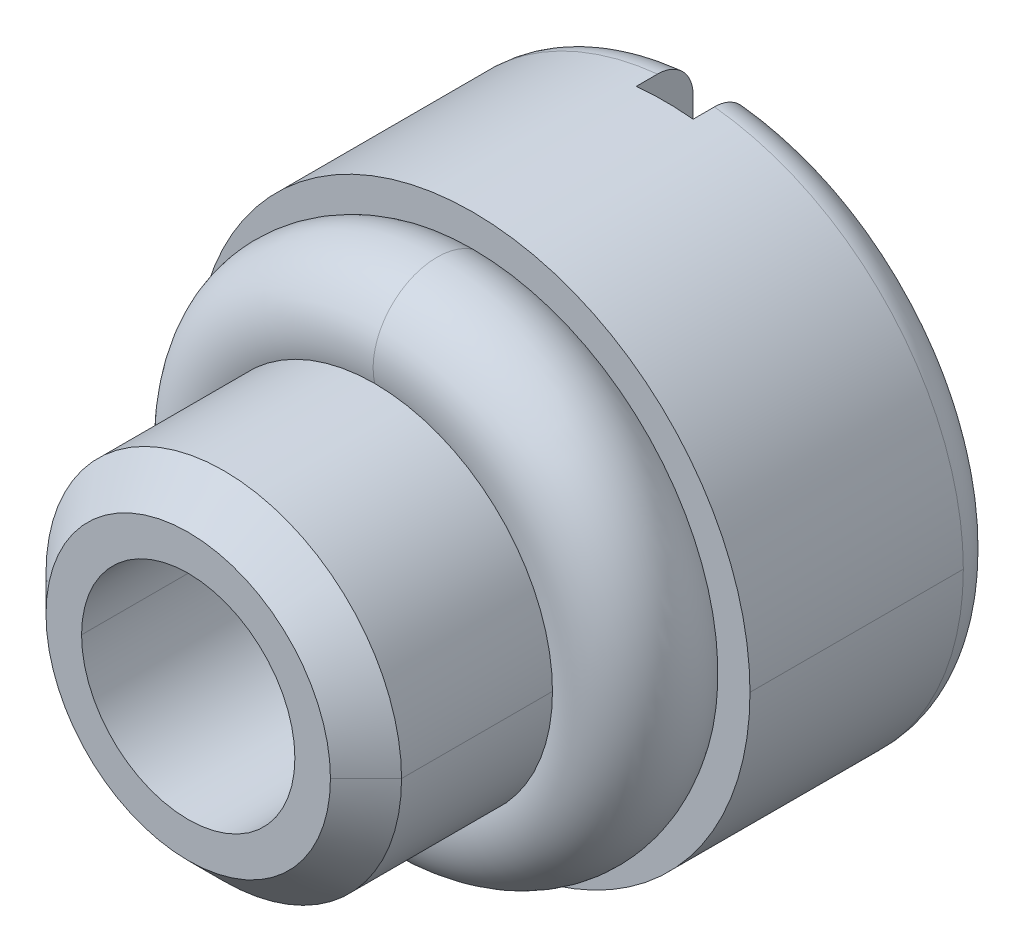
ISO-10303-21;
HEADER;
FILE_DESCRIPTION(('STEP AP214'),'2;1');
FILE_NAME('part.step','',(''),(''),'','','');
FILE_SCHEMA(('AUTOMOTIVE_DESIGN { 1 0 10303 214 1 1 1 1 }'));
ENDSEC;
DATA;
#1=APPLICATION_CONTEXT('core data for automotive mechanical design processes');
#2=APPLICATION_PROTOCOL_DEFINITION('international standard','automotive_design',2000,#1);
#3=PRODUCT_CONTEXT('',#1,'mechanical');
#4=PRODUCT('Part','Part','',(#3));
#5=PRODUCT_RELATED_PRODUCT_CATEGORY('part','',(#4));
#6=PRODUCT_DEFINITION_FORMATION('','',#4);
#7=PRODUCT_DEFINITION_CONTEXT('part definition',#1,'design');
#8=PRODUCT_DEFINITION('design','',#6,#7);
#9=PRODUCT_DEFINITION_SHAPE('','',#8);
#10=(LENGTH_UNIT() NAMED_UNIT(*) SI_UNIT(.MILLI.,.METRE.));
#11=(NAMED_UNIT(*) PLANE_ANGLE_UNIT() SI_UNIT($,.RADIAN.));
#12=(NAMED_UNIT(*) SI_UNIT($,.STERADIAN.) SOLID_ANGLE_UNIT());
#13=UNCERTAINTY_MEASURE_WITH_UNIT(LENGTH_MEASURE(1.E-05),#10,'distance_accuracy_value','');
#14=(GEOMETRIC_REPRESENTATION_CONTEXT(3) GLOBAL_UNCERTAINTY_ASSIGNED_CONTEXT((#13)) GLOBAL_UNIT_ASSIGNED_CONTEXT((#10,
#11,#12)) REPRESENTATION_CONTEXT('',''));
#15=CARTESIAN_POINT('',(0.,0.,0.));
#16=DIRECTION('',(0.,0.,1.));
#17=DIRECTION('',(1.,0.,0.));
#18=AXIS2_PLACEMENT_3D('',#15,#16,#17);
#19=CARTESIAN_POINT('',(0.4,5.115527708019,0.));
#20=DIRECTION('',(1.,0.,0.));
#21=DIRECTION('',(0.,1.,0.));
#22=AXIS2_PLACEMENT_3D('',#19,#20,#21);
#23=PLANE('',#22);
#24=CARTESIAN_POINT('',(0.400000000000024,-3.87943294825416,0.5));
#25=CARTESIAN_POINT('',(0.40000000411943,-3.87943311886585,0.491939682891677));
#26=CARTESIAN_POINT('',(0.400000345246995,-3.87923697986537,0.48387938101327));
#27=CARTESIAN_POINT('',(0.400001498944798,-3.8784525740742,0.467762278695054));
#28=CARTESIAN_POINT('',(0.400002312423804,-3.87786355108009,0.459705515048105));
#29=CARTESIAN_POINT('',(0.400004208510365,-3.87629234435605,0.443614536774049));
#30=CARTESIAN_POINT('',(0.400005291640127,-3.87530939546628,0.435580396855053));
#31=CARTESIAN_POINT('',(0.400007552872672,-3.87295048997405,0.419553825312462));
#32=CARTESIAN_POINT('',(0.400008731158619,-3.87157376180206,0.411561507252492));
#33=CARTESIAN_POINT('',(0.400011030540115,-3.86842832578584,0.395637822889961));
#34=CARTESIAN_POINT('',(0.400012151516973,-3.8666588419925,0.387706609858658));
#35=CARTESIAN_POINT('',(0.400014210065351,-3.86272989430234,0.371924411793107));
#36=CARTESIAN_POINT('',(0.400015147263054,-3.86056965238062,0.36407362044483));
#37=CARTESIAN_POINT('',(0.400016739511352,-3.85586214366341,0.348471528663627));
#38=CARTESIAN_POINT('',(0.400017393984578,-3.85331409911707,0.340720462894336));
#39=CARTESIAN_POINT('',(0.400018351940671,-3.84783490740447,0.32533702335693));
#40=CARTESIAN_POINT('',(0.400018654700897,-3.84490298520424,0.317704925635428));
#41=CARTESIAN_POINT('',(0.400018872847417,-3.83866092847447,0.302578512767008));
#42=CARTESIAN_POINT('',(0.400018787431109,-3.83535002413462,0.295084515289337));
#43=CARTESIAN_POINT('',(0.400018227679535,-3.82835586208734,0.280253233561971));
#44=CARTESIAN_POINT('',(0.400017752533676,-3.82467184235399,0.272916308670156));
#45=CARTESIAN_POINT('',(0.400016450814604,-3.81693827487332,0.258417893396746));
#46=CARTESIAN_POINT('',(0.400015623505207,-3.81288797548327,0.251256803948694));
#47=CARTESIAN_POINT('',(0.400013692239151,-3.80442963508127,0.237128520519677));
#48=CARTESIAN_POINT('',(0.400012587700975,-3.80002085542972,0.230161768748964));
#49=CARTESIAN_POINT('',(0.400010235432494,-3.79085429643702,0.216440314763256));
#50=CARTESIAN_POINT('',(0.400008987402353,-3.78609579408946,0.209686095557209));
#51=CARTESIAN_POINT('',(0.400006475847807,-3.77623946971036,0.196407490293331));
#52=CARTESIAN_POINT('',(0.400005212295948,-3.7711409429093,0.189883627348712));
#53=CARTESIAN_POINT('',(0.400003049243503,-3.76061520257124,0.177083148087374));
#54=CARTESIAN_POINT('',(0.400002150532419,-3.75518730513733,0.170807094215039));
#55=CARTESIAN_POINT('',(0.400000401083234,-3.74401429058611,0.158519037872238));
#56=CARTESIAN_POINT('',(0.399999550453086,-3.73826851281353,0.15250763581263));
#57=CARTESIAN_POINT('',(0.400000393997302,-3.72721322183282,0.141503146474786));
#58=CARTESIAN_POINT('',(0.400001786703737,-3.72193753278945,0.13647601644608));
#59=CARTESIAN_POINT('',(0.400007346035245,-3.71107907369244,0.12657170682327));
#60=CARTESIAN_POINT('',(0.400011560115864,-3.70549257542741,0.12169861211652));
#61=CARTESIAN_POINT('',(0.400021282927306,-3.6940126330278,0.112124067437141));
#62=CARTESIAN_POINT('',(0.400026812418038,-3.68811558849363,0.107426934590432));
#63=CARTESIAN_POINT('',(0.400038431950019,-3.67601592699402,0.0982265928395905));
#64=CARTESIAN_POINT('',(0.40004452980883,-3.66980985203254,0.0937279310381617));
#65=CARTESIAN_POINT('',(0.400056472856382,-3.6570949915595,0.0849474087376053));
#66=CARTESIAN_POINT('',(0.400062312249282,-3.65058290816412,0.0806703233748265));
#67=CARTESIAN_POINT('',(0.4000730916608,-3.63726042972391,0.0723563297749702));
#68=CARTESIAN_POINT('',(0.400078015616301,-3.63044691421796,0.0683244212367686));
#69=CARTESIAN_POINT('',(0.400086436606604,-3.61652760906326,0.0605245742999092));
#70=CARTESIAN_POINT('',(0.400089909695423,-3.60941889415471,0.0567618555821587));
#71=CARTESIAN_POINT('',(0.400095054753623,-3.59491694985007,0.0495244991313788));
#72=CARTESIAN_POINT('',(0.400096697667245,-3.58752100831554,0.0460552951811159));
#73=CARTESIAN_POINT('',(0.400097974287996,-3.57245417641281,0.0394292892686794));
#74=CARTESIAN_POINT('',(0.400097576629634,-3.56478080507595,0.0362781279908641));
#75=CARTESIAN_POINT('',(0.400094749693082,-3.54917056309561,0.0303126194517084));
#76=CARTESIAN_POINT('',(0.400092289666376,-3.5412314607236,0.0275041111912656));
#77=CARTESIAN_POINT('',(0.400085519638713,-3.5251031623471,0.0222482827369908));
#78=CARTESIAN_POINT('',(0.400081182531086,-3.51691200185649,0.0198069898571957));
#79=CARTESIAN_POINT('',(0.400071063770447,-3.50029501431835,0.015309785569112));
#80=CARTESIAN_POINT('',(0.400065261786776,-3.4918675078599,0.0132600782811833));
#81=CARTESIAN_POINT('',(0.400052860961045,-3.47479533369004,0.00956991538376813));
#82=CARTESIAN_POINT('',(0.400046251780464,-3.46614928919486,0.00793582781421679));
#83=CARTESIAN_POINT('',(0.400033150918901,-3.44865967098365,0.00510025705044405));
#84=CARTESIAN_POINT('',(0.400026662267545,-3.439815040284,0.00390529092116612));
#85=CARTESIAN_POINT('',(0.400014986283588,-3.4219500422299,0.00197075090288582));
#86=CARTESIAN_POINT('',(0.400009818567777,-3.4129289543087,0.00123782842798919));
#87=CARTESIAN_POINT('',(0.400002322995719,-3.39473503225962,0.000248942282012794));
#88=CARTESIAN_POINT('',(0.400000035561039,-3.38556183013564,-2.58544224473679E-07));
#89=CARTESIAN_POINT('',(0.400000000000008,-3.376388603227,0.));
#90=B_SPLINE_CURVE_WITH_KNOTS('',3,(#24,#25,#26,#27,#28,#29,#30,#31,#32,#33,#34,#35,#36,#37,#38,
#39,#40,#41,#42,#43,#44,#45,#46,#47,#48,#49,#50,#51,#52,#53,#54,#55,#56,#57,#58,#59,#60,#61,#62,
#63,#64,#65,#66,#67,#68,#69,#70,#71,#72,#73,#74,#75,#76,#77,#78,#79,#80,#81,#82,#83,#84,#85,#86,
#87,#88,#89),.UNSPECIFIED.,.F.,.F.,(4,2,2,2,2,2,2,2,2,2,2,2,2,2,2,2,2,2,2,2,2,2,2,2,2,2,2,2,2,2,
2,2,4),(0.,0.0241785456849397,0.0484037638321221,0.0726762667819843,0.0969966588605872,
0.121365534196,0.145783474592244,0.170251047479141,0.194768803955896,0.219337276945519,
0.243956979476288,0.268628403105435,0.293352016498981,0.318128264180356,0.342957565458916,
0.367840313547933,0.392776874879966,0.414632076905412,0.436864440437732,0.459474150276638,
0.482461351356608,0.505826150199764,0.529568616464974,0.553688784611573,0.578186655693591,
0.603062199297886,0.628315355636827,0.653946037803447,0.679954134194065,0.706339511100476,
0.733102015470839,0.760241477835435,0.78775771539061),.UNSPECIFIED.);
#91=CARTESIAN_POINT('',(0.4,-3.879432948254,0.5));
#92=VERTEX_POINT('',#91);
#93=CARTESIAN_POINT('',(0.4,-3.376388603227,0.));
#94=VERTEX_POINT('',#93);
#95=EDGE_CURVE('E285',#92,#94,#90,.T.);
#96=ORIENTED_EDGE('',*,*,#95,.F.);
#97=DIRECTION('',(0.,0.,1.));
#98=VECTOR('',#97,1.);
#99=CARTESIAN_POINT('',(0.4,-3.879432948254,0.5));
#100=LINE('',#99,#98);
#101=CARTESIAN_POINT('',(0.4,-3.879432948254,0.8));
#102=VERTEX_POINT('',#101);
#103=EDGE_CURVE('E270',#92,#102,#100,.T.);
#104=ORIENTED_EDGE('',*,*,#103,.T.);
#105=DIRECTION('',(0.,-1.,0.));
#106=VECTOR('',#105,1.);
#107=CARTESIAN_POINT('',(0.4,3.879432948254,0.8));
#108=LINE('',#107,#106);
#109=CARTESIAN_POINT('',(0.4,3.879432948254,0.8));
#110=VERTEX_POINT('',#109);
#111=EDGE_CURVE('E372',#110,#102,#108,.T.);
#112=ORIENTED_EDGE('',*,*,#111,.F.);
#113=DIRECTION('',(0.,0.,1.));
#114=VECTOR('',#113,1.);
#115=CARTESIAN_POINT('',(0.4,3.879432948254,0.5));
#116=LINE('',#115,#114);
#117=CARTESIAN_POINT('',(0.4,3.879432948254,0.5));
#118=VERTEX_POINT('',#117);
#119=EDGE_CURVE('E236',#118,#110,#116,.T.);
#120=ORIENTED_EDGE('',*,*,#119,.F.);
#121=CARTESIAN_POINT('',(0.400000000000015,3.376388603227,0.));
#122=CARTESIAN_POINT('',(0.400000035496117,3.38556007250395,-2.58357679064873E-07));
#123=CARTESIAN_POINT('',(0.400002326566478,3.39473151704892,0.000248846894338523));
#124=CARTESIAN_POINT('',(0.400009836643193,3.41292217304346,0.00123736578149127));
#125=CARTESIAN_POINT('',(0.400015015196688,3.42194175166684,0.00197003037706167));
#126=CARTESIAN_POINT('',(0.400026719728556,3.43980399052667,0.00390392100200372));
#127=CARTESIAN_POINT('',(0.400033226027681,3.44864736974604,0.00509850902852898));
#128=CARTESIAN_POINT('',(0.400046368087285,3.46613475001073,0.00793323202857667));
#129=CARTESIAN_POINT('',(0.400053000739028,3.47477980575559,0.00956686290376455));
#130=CARTESIAN_POINT('',(0.400065453015203,3.49185026867413,0.0132560617806501));
#131=CARTESIAN_POINT('',(0.400071282893362,3.50027704970852,0.0153052742359382));
#132=CARTESIAN_POINT('',(0.400081460160859,3.51689284981066,0.0198014777381134));
#133=CARTESIAN_POINT('',(0.400085827801849,3.52508354478869,0.0222422766584838));
#134=CARTESIAN_POINT('',(0.400092659493926,3.54121116897085,0.0274971438420761));
#135=CARTESIAN_POINT('',(0.400095150589358,3.54915005864375,0.0303051962657034));
#136=CARTESIAN_POINT('',(0.400098037862905,3.5647601220695,0.0362698555519004));
#137=CARTESIAN_POINT('',(0.400098464754512,3.57243352307685,0.0394206343540578));
#138=CARTESIAN_POINT('',(0.400097242177479,3.58750064811668,0.0460459712961635));
#139=CARTESIAN_POINT('',(0.400095624076849,3.59489684824577,0.0495148991489322));
#140=CARTESIAN_POINT('',(0.400090521416154,3.60939952777625,0.0567518305620664));
#141=CARTESIAN_POINT('',(0.400087065961958,3.61650871410306,0.0605144101889511));
#142=CARTESIAN_POINT('',(0.400078670092498,3.63042916200437,0.0683141347632436));
#143=CARTESIAN_POINT('',(0.400073753730266,3.63724334333983,0.0723460693309703));
#144=CARTESIAN_POINT('',(0.400062976271893,3.65056733320358,0.080660296860517));
#145=CARTESIAN_POINT('',(0.400057131413543,3.65708025646114,0.0849375988805429));
#146=CARTESIAN_POINT('',(0.40004516131932,3.66979695456756,0.0937187597602689));
#147=CARTESIAN_POINT('',(0.400039042126245,3.67600402138626,0.0982178517040434));
#148=CARTESIAN_POINT('',(0.400027359959277,3.68810580135465,0.107419279678737));
#149=CARTESIAN_POINT('',(0.40002178951313,3.69400396645077,0.112117076301914));
#150=CARTESIAN_POINT('',(0.400011964405197,3.70548626026554,0.121693192572679));
#151=CARTESIAN_POINT('',(0.40000768937348,3.71107398324901,0.126567202276457));
#152=CARTESIAN_POINT('',(0.400001974925644,3.72193497774857,0.136473600980589));
#153=CARTESIAN_POINT('',(0.400000488729355,3.72721197127902,0.141501911783646));
#154=CARTESIAN_POINT('',(0.399999442597034,3.73826748589524,0.152506602075751));
#155=CARTESIAN_POINT('',(0.400000182672797,3.74401228805153,0.158516918290141));
#156=CARTESIAN_POINT('',(0.400001745376393,3.75518359060634,0.170802853411092));
#157=CARTESIAN_POINT('',(0.400002567824597,3.76061074441032,0.177077878482907));
#158=CARTESIAN_POINT('',(0.400004599515063,3.77113522104825,0.189876376509366));
#159=CARTESIAN_POINT('',(0.400005807931719,3.77623322022944,0.196399293209411));
#160=CARTESIAN_POINT('',(0.400008231063028,3.78608869467307,0.209676107392125));
#161=CARTESIAN_POINT('',(0.400009445758972,3.79084686687667,0.216429487546818));
#162=CARTESIAN_POINT('',(0.400011749997617,3.80001295066409,0.230149387438989));
#163=CARTESIAN_POINT('',(0.400012839797913,3.80442157717033,0.237115429538673));
#164=CARTESIAN_POINT('',(0.400014757888307,3.81287977426078,0.251242438035212));
#165=CARTESIAN_POINT('',(0.400015586719562,3.81693007516795,0.258402967168694));
#166=CARTESIAN_POINT('',(0.400016905067334,3.8246637849133,0.272900424197517));
#167=CARTESIAN_POINT('',(0.400017395283645,3.82834793686828,0.28023695567355));
#168=CARTESIAN_POINT('',(0.400017996023911,3.83534247740018,0.295067628423346));
#169=CARTESIAN_POINT('',(0.400018107326896,3.83865361929133,0.302561414413611));
#170=CARTESIAN_POINT('',(0.400017948969169,3.84489623875603,0.31768759502796));
#171=CARTESIAN_POINT('',(0.400017680085369,3.84782847726608,0.325319675611443));
#172=CARTESIAN_POINT('',(0.400016795010385,3.85330836182355,0.340703281786584));
#173=CARTESIAN_POINT('',(0.400016179522895,3.85585677389271,0.348454534509922));
#174=CARTESIAN_POINT('',(0.400014667441752,3.86056504970091,0.364057208576017));
#175=CARTESIAN_POINT('',(0.400013771414063,3.86272568206384,0.371908397979727));
#176=CARTESIAN_POINT('',(0.400011794440394,3.86665541395708,0.387691605227491));
#177=CARTESIAN_POINT('',(0.400010713865071,3.8684252822942,0.395623431654344));
#178=CARTESIAN_POINT('',(0.400008491546515,3.87157146167327,0.411548557783676));
#179=CARTESIAN_POINT('',(0.400007349927676,3.87294853937851,0.419541706026963));
#180=CARTESIAN_POINT('',(0.400005155314518,3.87530808908664,0.435570152021603));
#181=CARTESIAN_POINT('',(0.400004102152155,3.87629132332917,0.443605337564973));
#182=CARTESIAN_POINT('',(0.400002256327129,3.87786301687455,0.459698617499326));
#183=CARTESIAN_POINT('',(0.400001463167228,3.87845223198474,0.467756638082986));
#184=CARTESIAN_POINT('',(0.400000337498178,3.87923690961059,0.483876458259292));
#185=CARTESIAN_POINT('',(0.400000004115657,3.87943311898315,0.491938221507288));
#186=CARTESIAN_POINT('',(0.400000000000011,3.87943294825416,0.5));
#187=B_SPLINE_CURVE_WITH_KNOTS('',3,(#121,#122,#123,#124,#125,#126,#127,#128,#129,#130,#131,
#132,#133,#134,#135,#136,#137,#138,#139,#140,#141,#142,#143,#144,#145,#146,#147,#148,#149,#150,
#151,#152,#153,#154,#155,#156,#157,#158,#159,#160,#161,#162,#163,#164,#165,#166,#167,#168,#169,
#170,#171,#172,#173,#174,#175,#176,#177,#178,#179,#180,#181,#182,#183,#184,#185,#186),
.UNSPECIFIED.,.F.,.F.,(4,2,2,2,2,2,2,2,2,2,2,2,2,2,2,2,2,2,2,2,2,2,2,2,2,2,2,2,2,2,2,2,4),(0.,
0.0275109667349627,0.0546458599966674,0.0814044973013111,0.107786709475477,0.133792343734969,
0.159421266605746,0.184673366680241,0.209548557205221,0.23404677850023,0.258168000208683,
0.28191222338651,0.305279482436198,0.328269846896788,0.350883423103084,0.373120355729888,
0.394980829239495,0.419913019581982,0.444791978230703,0.469618072059476,0.494391694691602,
0.51911326581399,0.543783230293978,0.568402057106752,0.592970238082889,0.617488286487157,
0.641956735441176,0.66637613620386,0.690747056324809,0.715070077686847,0.739345794454821,
0.763574810948463,0.787757739457687),.UNSPECIFIED.);
#188=CARTESIAN_POINT('',(0.4,3.376388603227,0.));
#189=VERTEX_POINT('',#188);
#190=EDGE_CURVE('E233',#189,#118,#187,.T.);
#191=ORIENTED_EDGE('',*,*,#190,.F.);
#192=DIRECTION('',(0.,1.,0.));
#193=VECTOR('',#192,1.);
#194=CARTESIAN_POINT('',(0.4,-3.376388603227,0.));
#195=LINE('',#194,#193);
#196=EDGE_CURVE('E288',#94,#189,#195,.T.);
#197=ORIENTED_EDGE('',*,*,#196,.F.);
#198=EDGE_LOOP('',(#96,#104,#112,#120,#191,#197));
#199=FACE_BOUND('',#198,.T.);
#200=ADVANCED_FACE('F16',(#199),#23,.F.);
#201=CARTESIAN_POINT('',(0.,0.,3.5));
#202=DIRECTION('',(0.,0.,1.));
#203=DIRECTION('',(1.,0.,0.));
#204=AXIS2_PLACEMENT_3D('',#201,#202,#203);
#205=PLANE('',#204);
#206=CARTESIAN_POINT('',(0.,0.,3.5));
#207=DIRECTION('',(0.,0.,1.));
#208=DIRECTION('',(-1.,0.,0.));
#209=AXIS2_PLACEMENT_3D('',#206,#207,#208);
#210=CIRCLE('',#209,1.5);
#211=CARTESIAN_POINT('',(-1.5,0.,3.5));
#212=VERTEX_POINT('',#211);
#213=CARTESIAN_POINT('',(1.5,0.,3.5));
#214=VERTEX_POINT('',#213);
#215=EDGE_CURVE('E11',#212,#214,#210,.T.);
#216=ORIENTED_EDGE('',*,*,#215,.T.);
#217=CARTESIAN_POINT('',(0.,0.,3.5));
#218=DIRECTION('',(0.,0.,1.));
#219=DIRECTION('',(1.,0.,0.));
#220=AXIS2_PLACEMENT_3D('',#217,#218,#219);
#221=CIRCLE('',#220,1.5);
#222=EDGE_CURVE('E355',#214,#212,#221,.T.);
#223=ORIENTED_EDGE('',*,*,#222,.T.);
#224=EDGE_LOOP('',(#216,#223));
#225=FACE_BOUND('',#224,.T.);
#226=ADVANCED_FACE('F256',(#225),#205,.T.);
#227=CARTESIAN_POINT('',(0.,0.,7.5));
#228=DIRECTION('',(0.,0.,1.));
#229=DIRECTION('',(1.,0.,0.));
#230=AXIS2_PLACEMENT_3D('',#227,#228,#229);
#231=CYLINDRICAL_SURFACE('',#230,1.5);
#232=DIRECTION('',(0.,0.,-1.));
#233=VECTOR('',#232,1.);
#234=CARTESIAN_POINT('',(1.5,0.,7.5));
#235=LINE('',#234,#233);
#236=CARTESIAN_POINT('',(1.5,0.,7.5));
#237=VERTEX_POINT('',#236);
#238=EDGE_CURVE('E27',#237,#214,#235,.T.);
#239=ORIENTED_EDGE('',*,*,#238,.T.);
#240=ORIENTED_EDGE('',*,*,#215,.F.);
#241=DIRECTION('',(0.,0.,-1.));
#242=VECTOR('',#241,1.);
#243=CARTESIAN_POINT('',(-1.5,0.,7.5));
#244=LINE('',#243,#242);
#245=CARTESIAN_POINT('',(-1.5,0.,7.5));
#246=VERTEX_POINT('',#245);
#247=EDGE_CURVE('E358',#246,#212,#244,.T.);
#248=ORIENTED_EDGE('',*,*,#247,.F.);
#249=CARTESIAN_POINT('',(0.,0.,7.5));
#250=DIRECTION('',(0.,0.,1.));
#251=DIRECTION('',(-1.,0.,0.));
#252=AXIS2_PLACEMENT_3D('',#249,#250,#251);
#253=CIRCLE('',#252,1.5);
#254=EDGE_CURVE('E366',#246,#237,#253,.T.);
#255=ORIENTED_EDGE('',*,*,#254,.T.);
#256=EDGE_LOOP('',(#239,#240,#248,#255));
#257=FACE_BOUND('',#256,.T.);
#258=ADVANCED_FACE('F774',(#257),#231,.F.);
#259=CARTESIAN_POINT('',(0.,0.,7.5));
#260=DIRECTION('',(0.,0.,1.));
#261=DIRECTION('',(1.,0.,0.));
#262=AXIS2_PLACEMENT_3D('',#259,#260,#261);
#263=CYLINDRICAL_SURFACE('',#262,1.5);
#264=ORIENTED_EDGE('',*,*,#247,.T.);
#265=ORIENTED_EDGE('',*,*,#222,.F.);
#266=ORIENTED_EDGE('',*,*,#238,.F.);
#267=CARTESIAN_POINT('',(0.,0.,7.5));
#268=DIRECTION('',(0.,0.,1.));
#269=DIRECTION('',(1.,0.,0.));
#270=AXIS2_PLACEMENT_3D('',#267,#268,#269);
#271=CIRCLE('',#270,1.5);
#272=EDGE_CURVE('E400',#237,#246,#271,.T.);
#273=ORIENTED_EDGE('',*,*,#272,.T.);
#274=EDGE_LOOP('',(#264,#265,#266,#273));
#275=FACE_BOUND('',#274,.T.);
#276=ADVANCED_FACE('F828',(#275),#263,.F.);
#277=CARTESIAN_POINT('',(0.,0.,3.5));
#278=DIRECTION('',(0.,0.,1.));
#279=DIRECTION('',(1.,0.,0.));
#280=AXIS2_PLACEMENT_3D('',#277,#278,#279);
#281=CYLINDRICAL_SURFACE('',#280,2.5);
#282=DIRECTION('',(-4.561400527472E-12,8.076966315919E-11,1.));
#283=VECTOR('',#282,1.);
#284=CARTESIAN_POINT('',(2.5,0.,4.877496438739));
#285=LINE('',#284,#283);
#286=CARTESIAN_POINT('',(2.5,0.,4.877496438739));
#287=VERTEX_POINT('',#286);
#288=CARTESIAN_POINT('',(2.5,0.,7.));
#289=VERTEX_POINT('',#288);
#290=EDGE_CURVE('E344',#287,#289,#285,.T.);
#291=ORIENTED_EDGE('',*,*,#290,.F.);
#292=CARTESIAN_POINT('',(0.,0.,4.877496438739));
#293=DIRECTION('',(0.,0.,1.));
#294=DIRECTION('',(1.,0.,0.));
#295=AXIS2_PLACEMENT_3D('',#292,#293,#294);
#296=CIRCLE('',#295,2.5);
#297=CARTESIAN_POINT('',(0.,2.5,4.877496438739));
#298=VERTEX_POINT('',#297);
#299=EDGE_CURVE('E349',#287,#298,#296,.T.);
#300=ORIENTED_EDGE('',*,*,#299,.T.);
#301=CARTESIAN_POINT('',(0.,0.,4.877496438739));
#302=DIRECTION('',(0.,0.,1.));
#303=DIRECTION('',(0.,1.,0.));
#304=AXIS2_PLACEMENT_3D('',#301,#302,#303);
#305=CIRCLE('',#304,2.5);
#306=CARTESIAN_POINT('',(-2.5,0.,4.877496438739));
#307=VERTEX_POINT('',#306);
#308=EDGE_CURVE('E334',#298,#307,#305,.T.);
#309=ORIENTED_EDGE('',*,*,#308,.T.);
#310=DIRECTION('',(4.561400527472E-12,-8.076973695818E-11,1.));
#311=VECTOR('',#310,1.);
#312=CARTESIAN_POINT('',(-2.5,0.,4.877496438739));
#313=LINE('',#312,#311);
#314=CARTESIAN_POINT('',(-2.5,0.,7.));
#315=VERTEX_POINT('',#314);
#316=EDGE_CURVE('E340',#307,#315,#313,.T.);
#317=ORIENTED_EDGE('',*,*,#316,.T.);
#318=CARTESIAN_POINT('',(0.,0.,7.));
#319=DIRECTION('',(0.,0.,1.));
#320=DIRECTION('',(1.,0.,0.));
#321=AXIS2_PLACEMENT_3D('',#318,#319,#320);
#322=CIRCLE('',#321,2.5);
#323=EDGE_CURVE('E362',#289,#315,#322,.T.);
#324=ORIENTED_EDGE('',*,*,#323,.F.);
#325=EDGE_LOOP('',(#291,#300,#309,#317,#324));
#326=FACE_BOUND('',#325,.T.);
#327=ADVANCED_FACE('F18',(#326),#281,.T.);
#328=CARTESIAN_POINT('',(0.,0.,7.25000000001));
#329=DIRECTION('',(0.,0.,-1.));
#330=DIRECTION('',(0.,-1.,0.));
#331=AXIS2_PLACEMENT_3D('',#328,#329,#330);
#332=CONICAL_SURFACE('',#331,2.24999999999,0.7853981633973);
#333=DIRECTION('',(0.707106781186548,-1.61639900679411E-11,-0.707106781186548));
#334=VECTOR('',#333,1.);
#335=CARTESIAN_POINT('',(1.99999999999,1.828633453721E-10,7.50000000001));
#336=LINE('',#335,#334);
#337=CARTESIAN_POINT('',(2.,0.,7.5));
#338=VERTEX_POINT('',#337);
#339=EDGE_CURVE('E371',#338,#289,#336,.T.);
#340=ORIENTED_EDGE('',*,*,#339,.T.);
#341=ORIENTED_EDGE('',*,*,#323,.T.);
#342=DIRECTION('',(-0.707106781186548,1.61629412215311E-11,-0.707106781186548));
#343=VECTOR('',#342,1.);
#344=CARTESIAN_POINT('',(-1.99999999999,-1.828626887228E-10,7.50000000001));
#345=LINE('',#344,#343);
#346=CARTESIAN_POINT('',(-2.,0.,7.5));
#347=VERTEX_POINT('',#346);
#348=EDGE_CURVE('E407',#347,#315,#345,.T.);
#349=ORIENTED_EDGE('',*,*,#348,.F.);
#350=CARTESIAN_POINT('',(0.,0.,7.5));
#351=DIRECTION('',(0.,0.,1.));
#352=DIRECTION('',(1.,0.,0.));
#353=AXIS2_PLACEMENT_3D('',#350,#351,#352);
#354=CIRCLE('',#353,2.);
#355=EDGE_CURVE('E363',#338,#347,#354,.T.);
#356=ORIENTED_EDGE('',*,*,#355,.F.);
#357=EDGE_LOOP('',(#340,#341,#349,#356));
#358=FACE_BOUND('',#357,.T.);
#359=ADVANCED_FACE('F214',(#358),#332,.T.);
#360=CARTESIAN_POINT('',(0.,0.,7.5));
#361=DIRECTION('',(0.,0.,1.));
#362=DIRECTION('',(1.,0.,0.));
#363=AXIS2_PLACEMENT_3D('',#360,#361,#362);
#364=PLANE('',#363);
#365=ORIENTED_EDGE('',*,*,#254,.F.);
#366=ORIENTED_EDGE('',*,*,#272,.F.);
#367=EDGE_LOOP('',(#365,#366));
#368=FACE_BOUND('',#367,.T.);
#369=CARTESIAN_POINT('',(0.,0.,7.5));
#370=DIRECTION('',(0.,0.,1.));
#371=DIRECTION('',(-1.,0.,0.));
#372=AXIS2_PLACEMENT_3D('',#369,#370,#371);
#373=CIRCLE('',#372,2.);
#374=EDGE_CURVE('E367',#347,#338,#373,.T.);
#375=ORIENTED_EDGE('',*,*,#374,.T.);
#376=ORIENTED_EDGE('',*,*,#355,.T.);
#377=EDGE_LOOP('',(#375,#376));
#378=FACE_BOUND('',#377,.T.);
#379=ADVANCED_FACE('F495',(#368,#378),#364,.T.);
#380=CARTESIAN_POINT('',(0.,0.,7.25000000001));
#381=DIRECTION('',(0.,0.,-1.));
#382=DIRECTION('',(0.,-1.,0.));
#383=AXIS2_PLACEMENT_3D('',#380,#381,#382);
#384=CONICAL_SURFACE('',#383,2.24999999999,0.7853981633973);
#385=ORIENTED_EDGE('',*,*,#348,.T.);
#386=CARTESIAN_POINT('',(0.,0.,7.));
#387=DIRECTION('',(0.,0.,1.));
#388=DIRECTION('',(-1.,0.,0.));
#389=AXIS2_PLACEMENT_3D('',#386,#387,#388);
#390=CIRCLE('',#389,2.5);
#391=EDGE_CURVE('E379',#315,#289,#390,.T.);
#392=ORIENTED_EDGE('',*,*,#391,.T.);
#393=ORIENTED_EDGE('',*,*,#339,.F.);
#394=ORIENTED_EDGE('',*,*,#374,.F.);
#395=EDGE_LOOP('',(#385,#392,#393,#394));
#396=FACE_BOUND('',#395,.T.);
#397=ADVANCED_FACE('F260',(#396),#384,.T.);
#398=CARTESIAN_POINT('',(0.,0.,3.5));
#399=DIRECTION('',(0.,0.,1.));
#400=DIRECTION('',(1.,0.,0.));
#401=AXIS2_PLACEMENT_3D('',#398,#399,#400);
#402=CYLINDRICAL_SURFACE('',#401,2.5);
#403=ORIENTED_EDGE('',*,*,#316,.F.);
#404=CARTESIAN_POINT('',(0.,0.,4.877496438739));
#405=DIRECTION('',(0.,0.,1.));
#406=DIRECTION('',(-1.,0.,0.));
#407=AXIS2_PLACEMENT_3D('',#404,#405,#406);
#408=CIRCLE('',#407,2.5);
#409=CARTESIAN_POINT('',(0.,-2.5,4.877496438739));
#410=VERTEX_POINT('',#409);
#411=EDGE_CURVE('E331',#307,#410,#408,.T.);
#412=ORIENTED_EDGE('',*,*,#411,.T.);
#413=CARTESIAN_POINT('',(0.,0.,4.877496438739));
#414=DIRECTION('',(0.,0.,1.));
#415=DIRECTION('',(0.,-1.,0.));
#416=AXIS2_PLACEMENT_3D('',#413,#414,#415);
#417=CIRCLE('',#416,2.5);
#418=EDGE_CURVE('E345',#410,#287,#417,.T.);
#419=ORIENTED_EDGE('',*,*,#418,.T.);
#420=ORIENTED_EDGE('',*,*,#290,.T.);
#421=ORIENTED_EDGE('',*,*,#391,.F.);
#422=EDGE_LOOP('',(#403,#412,#419,#420,#421));
#423=FACE_BOUND('',#422,.T.);
#424=ADVANCED_FACE('F487',(#423),#402,.T.);
#425=CARTESIAN_POINT('',(0.,0.,4.));
#426=DIRECTION('',(0.,0.,1.));
#427=DIRECTION('',(0.,1.,0.));
#428=AXIS2_PLACEMENT_3D('',#425,#426,#427);
#429=TOROIDAL_SURFACE('',#428,2.7,0.9);
#430=CARTESIAN_POINT('',(0.,0.,3.5));
#431=DIRECTION('',(0.,0.,1.));
#432=DIRECTION('',(0.,-1.,0.));
#433=AXIS2_PLACEMENT_3D('',#430,#431,#432);
#434=CIRCLE('',#433,3.448331477355);
#435=CARTESIAN_POINT('',(0.,-3.448331477355,3.5));
#436=VERTEX_POINT('',#435);
#437=CARTESIAN_POINT('',(0.,3.448331477355,3.5));
#438=VERTEX_POINT('',#437);
#439=EDGE_CURVE('E354',#436,#438,#434,.T.);
#440=ORIENTED_EDGE('',*,*,#439,.T.);
#441=CARTESIAN_POINT('',(0.,2.7,4.));
#442=DIRECTION('',(-1.,0.,0.));
#443=DIRECTION('',(0.,-0.222222222222195,0.974996043043575));
#444=AXIS2_PLACEMENT_3D('',#441,#442,#443);
#445=CIRCLE('',#444,0.9);
#446=EDGE_CURVE('E346',#298,#438,#445,.T.);
#447=ORIENTED_EDGE('',*,*,#446,.F.);
#448=ORIENTED_EDGE('',*,*,#299,.F.);
#449=ORIENTED_EDGE('',*,*,#418,.F.);
#450=CARTESIAN_POINT('',(0.,-2.7,4.));
#451=DIRECTION('',(-1.,0.,0.));
#452=DIRECTION('',(0.,-0.831479419283078,-0.555555555555585));
#453=AXIS2_PLACEMENT_3D('',#450,#451,#452);
#454=CIRCLE('',#453,0.9);
#455=EDGE_CURVE('E335',#436,#410,#454,.T.);
#456=ORIENTED_EDGE('',*,*,#455,.F.);
#457=EDGE_LOOP('',(#440,#447,#448,#449,#456));
#458=FACE_BOUND('',#457,.T.);
#459=ADVANCED_FACE('F433',(#458),#429,.T.);
#460=CARTESIAN_POINT('',(0.,0.,4.));
#461=DIRECTION('',(0.,0.,1.));
#462=DIRECTION('',(0.,1.,0.));
#463=AXIS2_PLACEMENT_3D('',#460,#461,#462);
#464=TOROIDAL_SURFACE('',#463,2.7,0.9);
#465=CARTESIAN_POINT('',(0.,0.,3.5));
#466=DIRECTION('',(0.,0.,1.));
#467=DIRECTION('',(0.,1.,0.));
#468=AXIS2_PLACEMENT_3D('',#465,#466,#467);
#469=CIRCLE('',#468,3.448331477355);
#470=EDGE_CURVE('E350',#438,#436,#469,.T.);
#471=ORIENTED_EDGE('',*,*,#470,.T.);
#472=ORIENTED_EDGE('',*,*,#455,.T.);
#473=ORIENTED_EDGE('',*,*,#411,.F.);
#474=ORIENTED_EDGE('',*,*,#308,.F.);
#475=ORIENTED_EDGE('',*,*,#446,.T.);
#476=EDGE_LOOP('',(#471,#472,#473,#474,#475));
#477=FACE_BOUND('',#476,.T.);
#478=ADVANCED_FACE('F483',(#477),#464,.T.);
#479=CARTESIAN_POINT('',(0.,0.,3.5));
#480=DIRECTION('',(0.,0.,1.));
#481=DIRECTION('',(1.,0.,0.));
#482=AXIS2_PLACEMENT_3D('',#479,#480,#481);
#483=PLANE('',#482);
#484=ORIENTED_EDGE('',*,*,#439,.F.);
#485=ORIENTED_EDGE('',*,*,#470,.F.);
#486=EDGE_LOOP('',(#484,#485));
#487=FACE_BOUND('',#486,.T.);
#488=CARTESIAN_POINT('',(0.,0.,3.5));
#489=DIRECTION('',(0.,0.,1.));
#490=DIRECTION('',(-1.,0.,0.));
#491=AXIS2_PLACEMENT_3D('',#488,#489,#490);
#492=CIRCLE('',#491,3.9);
#493=CARTESIAN_POINT('',(-3.9,0.,3.5));
#494=VERTEX_POINT('',#493);
#495=CARTESIAN_POINT('',(3.9,0.,3.5));
#496=VERTEX_POINT('',#495);
#497=EDGE_CURVE('E278',#494,#496,#492,.T.);
#498=ORIENTED_EDGE('',*,*,#497,.T.);
#499=CARTESIAN_POINT('',(0.,0.,3.5));
#500=DIRECTION('',(0.,0.,1.));
#501=DIRECTION('',(1.,0.,0.));
#502=AXIS2_PLACEMENT_3D('',#499,#500,#501);
#503=CIRCLE('',#502,3.9);
#504=EDGE_CURVE('E326',#496,#494,#503,.T.);
#505=ORIENTED_EDGE('',*,*,#504,.T.);
#506=EDGE_LOOP('',(#498,#505));
#507=FACE_BOUND('',#506,.T.);
#508=ADVANCED_FACE('F438',(#487,#507),#483,.T.);
#509=CARTESIAN_POINT('',(0.,0.,0.));
#510=DIRECTION('',(0.,0.,1.));
#511=DIRECTION('',(1.,0.,0.));
#512=AXIS2_PLACEMENT_3D('',#509,#510,#511);
#513=CYLINDRICAL_SURFACE('',#512,3.9);
#514=ORIENTED_EDGE('',*,*,#103,.F.);
#515=CARTESIAN_POINT('',(0.,0.,0.5));
#516=DIRECTION('',(0.,0.,-1.));
#517=DIRECTION('',(1.,0.,0.));
#518=AXIS2_PLACEMENT_3D('',#515,#516,#517);
#519=CIRCLE('',#518,3.9);
#520=CARTESIAN_POINT('',(3.9,0.,0.5));
#521=VERTEX_POINT('',#520);
#522=EDGE_CURVE('E232',#521,#92,#519,.T.);
#523=ORIENTED_EDGE('',*,*,#522,.F.);
#524=DIRECTION('',(0.,0.,1.));
#525=VECTOR('',#524,1.);
#526=CARTESIAN_POINT('',(3.9,0.,0.5));
#527=LINE('',#526,#525);
#528=EDGE_CURVE('E241',#521,#496,#527,.T.);
#529=ORIENTED_EDGE('',*,*,#528,.T.);
#530=ORIENTED_EDGE('',*,*,#497,.F.);
#531=DIRECTION('',(0.,0.,1.));
#532=VECTOR('',#531,1.);
#533=CARTESIAN_POINT('',(-3.9,0.,0.5));
#534=LINE('',#533,#532);
#535=CARTESIAN_POINT('',(-3.9,0.,0.5));
#536=VERTEX_POINT('',#535);
#537=EDGE_CURVE('E330',#536,#494,#534,.T.);
#538=ORIENTED_EDGE('',*,*,#537,.F.);
#539=CARTESIAN_POINT('',(0.,0.,0.5));
#540=DIRECTION('',(0.,0.,-1.));
#541=DIRECTION('',(-0.102564102564105,-0.994726396988247,0.));
#542=AXIS2_PLACEMENT_3D('',#539,#540,#541);
#543=CIRCLE('',#542,3.9);
#544=CARTESIAN_POINT('',(-0.4,-3.879432948254,0.5));
#545=VERTEX_POINT('',#544);
#546=EDGE_CURVE('E165',#545,#536,#543,.T.);
#547=ORIENTED_EDGE('',*,*,#546,.F.);
#548=DIRECTION('',(0.,0.,1.));
#549=VECTOR('',#548,1.);
#550=CARTESIAN_POINT('',(-0.4,-3.879432948254,0.5));
#551=LINE('',#550,#549);
#552=CARTESIAN_POINT('',(-0.4,-3.879432948254,0.8));
#553=VERTEX_POINT('',#552);
#554=EDGE_CURVE('E159',#545,#553,#551,.T.);
#555=ORIENTED_EDGE('',*,*,#554,.T.);
#556=CARTESIAN_POINT('',(0.,0.,0.8));
#557=DIRECTION('',(0.,0.,1.));
#558=DIRECTION('',(-0.102564102564105,-0.994726396988247,0.));
#559=AXIS2_PLACEMENT_3D('',#556,#557,#558);
#560=CIRCLE('',#559,3.9);
#561=EDGE_CURVE('E279',#553,#102,#560,.T.);
#562=ORIENTED_EDGE('',*,*,#561,.T.);
#563=EDGE_LOOP('',(#514,#523,#529,#530,#538,#547,#555,#562));
#564=FACE_BOUND('',#563,.T.);
#565=ADVANCED_FACE('F313',(#564),#513,.T.);
#566=CARTESIAN_POINT('',(0.,0.,0.8));
#567=DIRECTION('',(0.,0.,-1.));
#568=DIRECTION('',(0.,-1.,0.));
#569=AXIS2_PLACEMENT_3D('',#566,#567,#568);
#570=PLANE('',#569);
#571=ORIENTED_EDGE('',*,*,#111,.T.);
#572=ORIENTED_EDGE('',*,*,#561,.F.);
#573=DIRECTION('',(0.,1.,0.));
#574=VECTOR('',#573,1.);
#575=CARTESIAN_POINT('',(-0.4,-3.879432948254,0.8));
#576=LINE('',#575,#574);
#577=CARTESIAN_POINT('',(-0.4,3.879432948254,0.8));
#578=VERTEX_POINT('',#577);
#579=EDGE_CURVE('E196',#553,#578,#576,.T.);
#580=ORIENTED_EDGE('',*,*,#579,.T.);
#581=CARTESIAN_POINT('',(0.,0.,0.8));
#582=DIRECTION('',(0.,0.,1.));
#583=DIRECTION('',(0.102564102564105,0.994726396988247,0.));
#584=AXIS2_PLACEMENT_3D('',#581,#582,#583);
#585=CIRCLE('',#584,3.9);
#586=EDGE_CURVE('E240',#110,#578,#585,.T.);
#587=ORIENTED_EDGE('',*,*,#586,.F.);
#588=EDGE_LOOP('',(#571,#572,#580,#587));
#589=FACE_BOUND('',#588,.T.);
#590=ADVANCED_FACE('F216',(#589),#570,.T.);
#591=CARTESIAN_POINT('',(0.,0.,0.));
#592=DIRECTION('',(0.,0.,1.));
#593=DIRECTION('',(1.,0.,0.));
#594=AXIS2_PLACEMENT_3D('',#591,#592,#593);
#595=CYLINDRICAL_SURFACE('',#594,3.9);
#596=DIRECTION('',(0.,0.,1.));
#597=VECTOR('',#596,1.);
#598=CARTESIAN_POINT('',(-0.4,3.879432948254,0.5));
#599=LINE('',#598,#597);
#600=CARTESIAN_POINT('',(-0.4,3.879432948254,0.5));
#601=VERTEX_POINT('',#600);
#602=EDGE_CURVE('E339',#601,#578,#599,.T.);
#603=ORIENTED_EDGE('',*,*,#602,.F.);
#604=CARTESIAN_POINT('',(0.,0.,0.5));
#605=DIRECTION('',(0.,0.,-1.));
#606=DIRECTION('',(-1.,0.,0.));
#607=AXIS2_PLACEMENT_3D('',#604,#605,#606);
#608=CIRCLE('',#607,3.9);
#609=EDGE_CURVE('E191',#536,#601,#608,.T.);
#610=ORIENTED_EDGE('',*,*,#609,.F.);
#611=ORIENTED_EDGE('',*,*,#537,.T.);
#612=ORIENTED_EDGE('',*,*,#504,.F.);
#613=ORIENTED_EDGE('',*,*,#528,.F.);
#614=CARTESIAN_POINT('',(0.,0.,0.5));
#615=DIRECTION('',(0.,0.,-1.));
#616=DIRECTION('',(0.102564102564105,0.994726396988247,0.));
#617=AXIS2_PLACEMENT_3D('',#614,#615,#616);
#618=CIRCLE('',#617,3.9);
#619=EDGE_CURVE('E229',#118,#521,#618,.T.);
#620=ORIENTED_EDGE('',*,*,#619,.F.);
#621=ORIENTED_EDGE('',*,*,#119,.T.);
#622=ORIENTED_EDGE('',*,*,#586,.T.);
#623=EDGE_LOOP('',(#603,#610,#611,#612,#613,#620,#621,#622));
#624=FACE_BOUND('',#623,.T.);
#625=ADVANCED_FACE('F312',(#624),#595,.T.);
#626=CARTESIAN_POINT('',(0.,0.,0.5));
#627=DIRECTION('',(0.,0.,1.));
#628=DIRECTION('',(-0.999972093740069,-0.00747072560750977,0.));
#629=AXIS2_PLACEMENT_3D('',#626,#627,#628);
#630=TOROIDAL_SURFACE('',#629,3.4,0.5);
#631=ORIENTED_EDGE('',*,*,#190,.T.);
#632=ORIENTED_EDGE('',*,*,#619,.T.);
#633=ORIENTED_EDGE('',*,*,#522,.T.);
#634=ORIENTED_EDGE('',*,*,#95,.T.);
#635=CARTESIAN_POINT('',(0.,0.,0.));
#636=DIRECTION('',(0.,0.,-1.));
#637=DIRECTION('',(0.117647058823501,0.993055471537305,0.));
#638=AXIS2_PLACEMENT_3D('',#635,#636,#637);
#639=CIRCLE('',#638,3.4);
#640=EDGE_CURVE('E172',#189,#94,#639,.T.);
#641=ORIENTED_EDGE('',*,*,#640,.F.);
#642=EDGE_LOOP('',(#631,#632,#633,#634,#641));
#643=FACE_BOUND('',#642,.T.);
#644=ADVANCED_FACE('F213',(#643),#630,.T.);
#645=CARTESIAN_POINT('',(0.,0.,0.5));
#646=DIRECTION('',(0.,0.,1.));
#647=DIRECTION('',(-0.999972093740069,-0.00747072560750977,0.));
#648=AXIS2_PLACEMENT_3D('',#645,#646,#647);
#649=TOROIDAL_SURFACE('',#648,3.4,0.5);
#650=CARTESIAN_POINT('',(-0.40000000000003,3.87943294825416,0.5));
#651=CARTESIAN_POINT('',(-0.400000004119437,3.87943311886585,0.491939682888409));
#652=CARTESIAN_POINT('',(-0.400000345246984,3.87923697986522,0.483879381006733));
#653=CARTESIAN_POINT('',(-0.400001498944723,3.87845257407343,0.467762278682437));
#654=CARTESIAN_POINT('',(-0.400002312423683,3.87786355107889,0.459705515032677));
#655=CARTESIAN_POINT('',(-0.400004208510132,3.87629234435377,0.443614536753473));
#656=CARTESIAN_POINT('',(-0.40000529163983,3.87530939546336,0.435580396832138));
#657=CARTESIAN_POINT('',(-0.400007552872228,3.87295048996969,0.419553825285354));
#658=CARTESIAN_POINT('',(-0.400008731158092,3.87157376179691,0.411561507223527));
#659=CARTESIAN_POINT('',(-0.400011030539416,3.86842832577904,0.395637822857772));
#660=CARTESIAN_POINT('',(-0.400012151516183,3.86665884198483,0.387706609825096));
#661=CARTESIAN_POINT('',(-0.400014210064376,3.86272989429292,0.371924411757288));
#662=CARTESIAN_POINT('',(-0.400015147261985,3.86056965237032,0.364073620408121));
#663=CARTESIAN_POINT('',(-0.400016739510105,3.8558621436514,0.348471528625616));
#664=CARTESIAN_POINT('',(-0.400017393983246,3.85331409910424,0.340720462855906));
#665=CARTESIAN_POINT('',(-0.400018351939177,3.84783490739008,0.325337023318127));
#666=CARTESIAN_POINT('',(-0.400018654699324,3.84490298518915,0.317704925596663));
#667=CARTESIAN_POINT('',(-0.40001887284571,3.83866092845812,0.302578512728763));
#668=CARTESIAN_POINT('',(-0.400018787429345,3.83535002411774,0.295084515251565));
#669=CARTESIAN_POINT('',(-0.400018227677679,3.82835586206962,0.280253233525561));
#670=CARTESIAN_POINT('',(-0.400017752531786,3.82467184233597,0.272916308634626));
#671=CARTESIAN_POINT('',(-0.400016450812675,3.81693827485498,0.258417893363359));
#672=CARTESIAN_POINT('',(-0.400015623503277,3.81288797546492,0.251256803916561));
#673=CARTESIAN_POINT('',(-0.400013692237251,3.80442963506324,0.237128520490395));
#674=CARTESIAN_POINT('',(-0.400012587699108,3.80002085541204,0.23016176872127));
#675=CARTESIAN_POINT('',(-0.400010235430733,3.79085429642041,0.216440314739038));
#676=CARTESIAN_POINT('',(-0.400008987400664,3.78609579407358,0.209686095534868));
#677=CARTESIAN_POINT('',(-0.400006475846318,3.77623946969638,0.196407490274996));
#678=CARTESIAN_POINT('',(-0.400005212294584,3.7711409428965,0.189883627332493));
#679=CARTESIAN_POINT('',(-0.400003049242435,3.76061520256127,0.177083148075587));
#680=CARTESIAN_POINT('',(-0.40000215053152,3.75518730512902,0.170807094205554));
#681=CARTESIAN_POINT('',(-0.400000401082751,3.74401429058163,0.158519037867497));
#682=CARTESIAN_POINT('',(-0.399999550452849,3.73826851281123,0.152507635810318));
#683=CARTESIAN_POINT('',(-0.400000393997521,3.72721322183002,0.141503146472024));
#684=CARTESIAN_POINT('',(-0.400001786704168,3.72193753278373,0.136476016440676));
#685=CARTESIAN_POINT('',(-0.400007346036024,3.71107907368105,0.126571706813193));
#686=CARTESIAN_POINT('',(-0.400011560116775,3.70549257541329,0.121698612104396));
#687=CARTESIAN_POINT('',(-0.400021282928445,3.69401263300842,0.112124067421502));
#688=CARTESIAN_POINT('',(-0.40002681241927,3.68811558847174,0.107426934573308));
#689=CARTESIAN_POINT('',(-0.400038431951391,3.67601592696739,0.0982265928200363));
#690=CARTESIAN_POINT('',(-0.400044529810249,3.66980985200369,0.093727931017645));
#691=CARTESIAN_POINT('',(-0.400056472857861,3.65709499152654,0.0849474087156598));
#692=CARTESIAN_POINT('',(-0.400062312250776,3.65058290812927,0.0806703233523965));
#693=CARTESIAN_POINT('',(-0.40007309166229,3.63726042968569,0.0723563297520169));
#694=CARTESIAN_POINT('',(-0.400078015617773,3.63044691417825,0.0683244212137571));
#695=CARTESIAN_POINT('',(-0.400086436608017,3.616527609021,0.0605245742771713));
#696=CARTESIAN_POINT('',(-0.400089909696796,3.60941889411139,0.0567618555597317));
#697=CARTESIAN_POINT('',(-0.400095054754903,3.5949169498051,0.0495244991099026));
#698=CARTESIAN_POINT('',(-0.40009669766847,3.58752100826999,0.0460552951602575));
#699=CARTESIAN_POINT('',(-0.4000979742891,3.57245417636661,0.0394292892493175));
#700=CARTESIAN_POINT('',(-0.40009757663067,3.56478080502968,0.0362781279723577));
#701=CARTESIAN_POINT('',(-0.400094749693982,3.54917056304974,0.0303126194351017));
#702=CARTESIAN_POINT('',(-0.400092289667207,3.54123146067821,0.0275041111756787));
#703=CARTESIAN_POINT('',(-0.400085519639404,3.52510316230321,0.0222482827235544));
#704=CARTESIAN_POINT('',(-0.400081182531705,3.51691200181364,0.0198069898448643));
#705=CARTESIAN_POINT('',(-0.400071063770936,3.50029501427817,0.0153097855590194));
#706=CARTESIAN_POINT('',(-0.400065261787205,3.49186750782133,0.0132600782721978));
#707=CARTESIAN_POINT('',(-0.400052860961359,3.4747953336553,0.00956991537693926));
#708=CARTESIAN_POINT('',(-0.400046251780721,3.46614928916233,0.00793582780840955));
#709=CARTESIAN_POINT('',(-0.400033150919064,3.44865967095614,0.00510025704653338));
#710=CARTESIAN_POINT('',(-0.40002666226767,3.43981504025928,0.00390529091810139));
#711=CARTESIAN_POINT('',(-0.400014986283648,3.42195004221136,0.0019707509012739));
#712=CARTESIAN_POINT('',(-0.40000981856781,3.41292895429353,0.00123782842695416));
#713=CARTESIAN_POINT('',(-0.400002322995717,3.39473503225175,0.000248942281799362));
#714=CARTESIAN_POINT('',(-0.400000035561028,3.38556183013171,-2.58544224092667E-07));
#715=CARTESIAN_POINT('',(-0.399999999999998,3.376388603227,0.));
#716=B_SPLINE_CURVE_WITH_KNOTS('',3,(#650,#651,#652,#653,#654,#655,#656,#657,#658,#659,#660,
#661,#662,#663,#664,#665,#666,#667,#668,#669,#670,#671,#672,#673,#674,#675,#676,#677,#678,#679,
#680,#681,#682,#683,#684,#685,#686,#687,#688,#689,#690,#691,#692,#693,#694,#695,#696,#697,#698,
#699,#700,#701,#702,#703,#704,#705,#706,#707,#708,#709,#710,#711,#712,#713,#714,#715),
.UNSPECIFIED.,.F.,.F.,(4,2,2,2,2,2,2,2,2,2,2,2,2,2,2,2,2,2,2,2,2,2,2,2,2,2,2,2,2,2,2,2,4),(0.,
0.024178545694743,0.0484037638504212,0.072676266807472,0.0969966588919561,0.121365534231943,
0.145783474631453,0.170251047520309,0.194768803997717,0.219337276986687,0.243956979515497,
0.26862840314138,0.293352016530358,0.318128264205862,0.342957565477247,0.367840313557789,
0.392776874880045,0.414632076917284,0.436864440459824,0.45947415030738,0.482461351394426,
0.505826150243085,0.529568616512226,0.553688784661181,0.578186655743983,0.603062199347487,
0.628315355684066,0.65394603784675,0.679954134231861,0.706339511131191,0.733102015492903,
0.760241477847278,0.787757715390663),.UNSPECIFIED.);
#717=CARTESIAN_POINT('',(-0.4,3.376388603227,0.));
#718=VERTEX_POINT('',#717);
#719=EDGE_CURVE('E175',#601,#718,#716,.T.);
#720=ORIENTED_EDGE('',*,*,#719,.T.);
#721=CARTESIAN_POINT('',(0.,0.,0.));
#722=DIRECTION('',(0.,0.,-1.));
#723=DIRECTION('',(-0.117647058823501,-0.993055471537305,0.));
#724=AXIS2_PLACEMENT_3D('',#721,#722,#723);
#725=CIRCLE('',#724,3.4);
#726=CARTESIAN_POINT('',(-0.4,-3.376388603227,0.));
#727=VERTEX_POINT('',#726);
#728=EDGE_CURVE('E170',#727,#718,#725,.T.);
#729=ORIENTED_EDGE('',*,*,#728,.F.);
#730=CARTESIAN_POINT('',(-0.400000000000003,-3.376388603227,0.));
#731=CARTESIAN_POINT('',(-0.40000003549611,-3.38556007250133,-2.58357678626342E-07));
#732=CARTESIAN_POINT('',(-0.400002326566476,-3.39473151704368,0.000248846894196456));
#733=CARTESIAN_POINT('',(-0.400009836643209,-3.41292217303335,0.00123736578080161));
#734=CARTESIAN_POINT('',(-0.400015015196718,-3.42194175165448,0.00197003037598752));
#735=CARTESIAN_POINT('',(-0.400026719728627,-3.43980399051019,0.00390392099996157));
#736=CARTESIAN_POINT('',(-0.400033226027781,-3.4486473697277,0.00509850902592329));
#737=CARTESIAN_POINT('',(-0.400046368087449,-3.46613474998905,0.00793323202470726));
#738=CARTESIAN_POINT('',(-0.400053000739227,-3.47477980573244,0.00956686289921431));
#739=CARTESIAN_POINT('',(-0.400065453015477,-3.49185026864844,0.0132560617746627));
#740=CARTESIAN_POINT('',(-0.400071282893675,-3.50027704968174,0.0153052742292131));
#741=CARTESIAN_POINT('',(-0.400081460161258,-3.51689284978211,0.0198014777298965));
#742=CARTESIAN_POINT('',(-0.400085827802296,-3.52508354475945,0.0222422766495306));
#743=CARTESIAN_POINT('',(-0.400092659494467,-3.5412111689406,0.0274971438316899));
#744=CARTESIAN_POINT('',(-0.400095150589945,-3.54915005861318,0.0303051962546377));
#745=CARTESIAN_POINT('',(-0.400098037863581,-3.56476012203867,0.0362698555395686));
#746=CARTESIAN_POINT('',(-0.400098464755231,-3.57243352304606,0.0394206343411559));
#747=CARTESIAN_POINT('',(-0.40009724217828,-3.58750064808633,0.0460459712822642));
#748=CARTESIAN_POINT('',(-0.400095624077687,-3.59489684821581,0.0495148991346211));
#749=CARTESIAN_POINT('',(-0.400090521417056,-3.60939952774739,0.0567518305471217));
#750=CARTESIAN_POINT('',(-0.400087065962885,-3.6165087140749,0.0605144101737992));
#751=CARTESIAN_POINT('',(-0.400078670093463,-3.6304291619779,0.0683141347479093));
#752=CARTESIAN_POINT('',(-0.400073753731244,-3.63724334331436,0.0723460693156746));
#753=CARTESIAN_POINT('',(-0.400062976272873,-3.65056733318036,0.0806602968455699));
#754=CARTESIAN_POINT('',(-0.400057131414513,-3.65708025643917,0.0849375988659188));
#755=CARTESIAN_POINT('',(-0.400045161320247,-3.66979695454833,0.0937187597465966));
#756=CARTESIAN_POINT('',(-0.400039042127142,-3.67600402136851,0.0982178516910123));
#757=CARTESIAN_POINT('',(-0.400027359960082,-3.68810580134006,0.107419279667325));
#758=CARTESIAN_POINT('',(-0.400021789513876,-3.69400396643785,0.112117076291492));
#759=CARTESIAN_POINT('',(-0.400011964405789,-3.70548626025612,0.1216931925646));
#760=CARTESIAN_POINT('',(-0.400007689373977,-3.71107398324142,0.126567202269742));
#761=CARTESIAN_POINT('',(-0.400001974925908,-3.72193497774476,0.136473600976988));
#762=CARTESIAN_POINT('',(-0.400000488729481,-3.72721197127715,0.141501911781806));
#763=CARTESIAN_POINT('',(-0.399999442596859,-3.73826748589371,0.15250660207421));
#764=CARTESIAN_POINT('',(-0.400000182672458,-3.74401228804854,0.158516918286981));
#765=CARTESIAN_POINT('',(-0.400001745375775,-3.75518359060081,0.17080285340477));
#766=CARTESIAN_POINT('',(-0.400002567823866,-3.76061074440367,0.177077878475051));
#767=CARTESIAN_POINT('',(-0.400004599514138,-3.77113522103972,0.189876376498557));
#768=CARTESIAN_POINT('',(-0.400005807930714,-3.77623322022013,0.196399293197191));
#769=CARTESIAN_POINT('',(-0.400008231061892,-3.78608869466249,0.209676107377235));
#770=CARTESIAN_POINT('',(-0.400009445757785,-3.79084686686559,0.216429487530677));
#771=CARTESIAN_POINT('',(-0.40001174999636,-3.80001295065231,0.230149387420531));
#772=CARTESIAN_POINT('',(-0.400012839796638,-3.80442157715832,0.237115429519157));
#773=CARTESIAN_POINT('',(-0.400014757887014,-3.81287977424855,0.251242438013796));
#774=CARTESIAN_POINT('',(-0.400015586718269,-3.81693007515573,0.258402967146442));
#775=CARTESIAN_POINT('',(-0.400016905066064,-3.82466378490128,0.272900424173836));
#776=CARTESIAN_POINT('',(-0.4000173952824,-3.82834793685646,0.280236955649283));
#777=CARTESIAN_POINT('',(-0.400017996022729,-3.83534247738893,0.295067628398171));
#778=CARTESIAN_POINT('',(-0.400018107325751,-3.83865361928044,0.302561414388121));
#779=CARTESIAN_POINT('',(-0.400017948968112,-3.84489623874597,0.317687595002123));
#780=CARTESIAN_POINT('',(-0.400017680084364,-3.8478284772565,0.325319675585582));
#781=CARTESIAN_POINT('',(-0.400016795009493,-3.853308361815,0.340703281760971));
#782=CARTESIAN_POINT('',(-0.400016179522065,-3.8558567738847,0.348454534484588));
#783=CARTESIAN_POINT('',(-0.400014667441042,-3.86056504969405,0.36405720855155));
#784=CARTESIAN_POINT('',(-0.400013771413411,-3.86272568205756,0.371908397955854));
#785=CARTESIAN_POINT('',(-0.400011794439863,-3.86665541395197,0.387691605205122));
#786=CARTESIAN_POINT('',(-0.400010713864602,-3.86842528228966,0.395623431632889));
#787=CARTESIAN_POINT('',(-0.400008491546161,-3.87157146166984,0.411548557764371));
#788=CARTESIAN_POINT('',(-0.400007349927376,-3.87294853937561,0.419541706008895));
#789=CARTESIAN_POINT('',(-0.400005155314318,-3.87530808908469,0.435570152006331));
#790=CARTESIAN_POINT('',(-0.400004102152003,-3.87629132332765,0.443605337551259));
#791=CARTESIAN_POINT('',(-0.400002256327052,-3.87786301687375,0.459698617489043));
#792=CARTESIAN_POINT('',(-0.40000146316718,-3.87845223198423,0.467756638074577));
#793=CARTESIAN_POINT('',(-0.40000033749817,-3.87923690961048,0.483876458254935));
#794=CARTESIAN_POINT('',(-0.40000000411566,-3.87943311898315,0.49193822150511));
#795=CARTESIAN_POINT('',(-0.400000000000015,-3.87943294825416,0.5));
#796=B_SPLINE_CURVE_WITH_KNOTS('',3,(#730,#731,#732,#733,#734,#735,#736,#737,#738,#739,#740,
#741,#742,#743,#744,#745,#746,#747,#748,#749,#750,#751,#752,#753,#754,#755,#756,#757,#758,#759,
#760,#761,#762,#763,#764,#765,#766,#767,#768,#769,#770,#771,#772,#773,#774,#775,#776,#777,#778,
#779,#780,#781,#782,#783,#784,#785,#786,#787,#788,#789,#790,#791,#792,#793,#794,#795),
.UNSPECIFIED.,.F.,.F.,(4,2,2,2,2,2,2,2,2,2,2,2,2,2,2,2,2,2,2,2,2,2,2,2,2,2,2,2,2,2,2,2,4),(0.,
0.0275109667271049,0.0546458599819989,0.0814044972808771,0.107786709450326,0.133792343706147,
0.1594212665743,0.184673366647221,0.209548557171674,0.234046778467207,0.258168000177229,
0.281912223357675,0.305279482411031,0.328269846876337,0.350883423088397,0.373120355722013,
0.394980829239479,0.419913019575449,0.444791978218521,0.469618072042512,0.494391694670725,
0.519113265790067,0.54378323026788,0.568402057079349,0.592970238055051,0.617488286459754,
0.641956735415079,0.66637613617994,0.690747056303937,0.715070077669895,0.73934579444266,
0.763574810941965,0.787757739457722),.UNSPECIFIED.);
#797=EDGE_CURVE('E150',#727,#545,#796,.T.);
#798=ORIENTED_EDGE('',*,*,#797,.T.);
#799=ORIENTED_EDGE('',*,*,#546,.T.);
#800=ORIENTED_EDGE('',*,*,#609,.T.);
#801=EDGE_LOOP('',(#720,#729,#798,#799,#800));
#802=FACE_BOUND('',#801,.T.);
#803=ADVANCED_FACE('F174',(#802),#649,.T.);
#804=CARTESIAN_POINT('',(-0.4,-4.263953607778,0.));
#805=DIRECTION('',(-1.,0.,0.));
#806=DIRECTION('',(0.,0.,1.));
#807=AXIS2_PLACEMENT_3D('',#804,#805,#806);
#808=PLANE('',#807);
#809=ORIENTED_EDGE('',*,*,#719,.F.);
#810=ORIENTED_EDGE('',*,*,#602,.T.);
#811=ORIENTED_EDGE('',*,*,#579,.F.);
#812=ORIENTED_EDGE('',*,*,#554,.F.);
#813=ORIENTED_EDGE('',*,*,#797,.F.);
#814=DIRECTION('',(0.,1.,0.));
#815=VECTOR('',#814,1.);
#816=CARTESIAN_POINT('',(-0.4,-3.376388603227,0.));
#817=LINE('',#816,#815);
#818=EDGE_CURVE('E155',#727,#718,#817,.T.);
#819=ORIENTED_EDGE('',*,*,#818,.T.);
#820=EDGE_LOOP('',(#809,#810,#811,#812,#813,#819));
#821=FACE_BOUND('',#820,.T.);
#822=ADVANCED_FACE('F154',(#821),#808,.F.);
#823=CARTESIAN_POINT('',(0.,0.,0.));
#824=DIRECTION('',(0.,0.,1.));
#825=DIRECTION('',(1.,0.,0.));
#826=AXIS2_PLACEMENT_3D('',#823,#824,#825);
#827=PLANE('',#826);
#828=ORIENTED_EDGE('',*,*,#640,.T.);
#829=ORIENTED_EDGE('',*,*,#196,.T.);
#830=EDGE_LOOP('',(#828,#829));
#831=FACE_BOUND('',#830,.T.);
#832=ADVANCED_FACE('F258',(#831),#827,.F.);
#833=CARTESIAN_POINT('',(0.,0.,0.));
#834=DIRECTION('',(0.,0.,1.));
#835=DIRECTION('',(1.,0.,0.));
#836=AXIS2_PLACEMENT_3D('',#833,#834,#835);
#837=PLANE('',#836);
#838=ORIENTED_EDGE('',*,*,#728,.T.);
#839=ORIENTED_EDGE('',*,*,#818,.F.);
#840=EDGE_LOOP('',(#838,#839));
#841=FACE_BOUND('',#840,.T.);
#842=ADVANCED_FACE('F169',(#841),#837,.F.);
#843=CLOSED_SHELL('',(#200,#226,#258,#276,#327,#359,#379,#397,#424,#459,#478,#508,#565,#590,
#625,#644,#803,#822,#832,#842));
#844=MANIFOLD_SOLID_BREP('B1',#843);
#845=ADVANCED_BREP_SHAPE_REPRESENTATION('',(#18,#844),#14);
#846=SHAPE_DEFINITION_REPRESENTATION(#9,#845);
ENDSEC;
END-ISO-10303-21;
